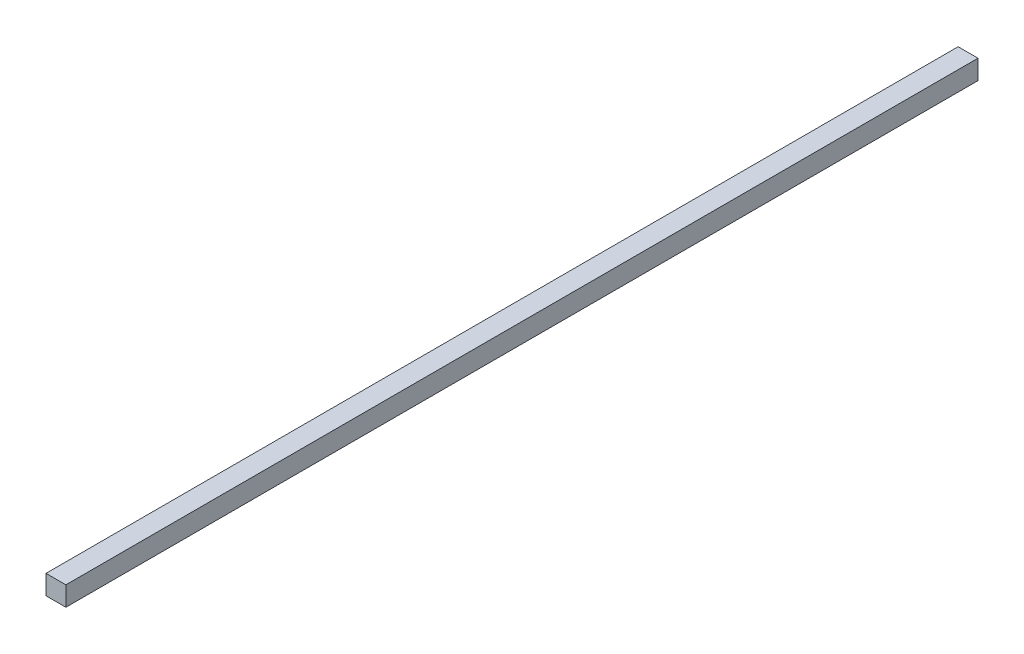
ISO-10303-21;
HEADER;
FILE_DESCRIPTION(('STEP AP214'),'2;1');
FILE_NAME('part.step','',(''),(''),'','','');
FILE_SCHEMA(('AUTOMOTIVE_DESIGN { 1 0 10303 214 1 1 1 1 }'));
ENDSEC;
DATA;
#1=APPLICATION_CONTEXT('core data for automotive mechanical design processes');
#2=APPLICATION_PROTOCOL_DEFINITION('international standard','automotive_design',2000,#1);
#3=PRODUCT_CONTEXT('',#1,'mechanical');
#4=PRODUCT('Part','Part','',(#3));
#5=PRODUCT_RELATED_PRODUCT_CATEGORY('part','',(#4));
#6=PRODUCT_DEFINITION_FORMATION('','',#4);
#7=PRODUCT_DEFINITION_CONTEXT('part definition',#1,'design');
#8=PRODUCT_DEFINITION('design','',#6,#7);
#9=PRODUCT_DEFINITION_SHAPE('','',#8);
#10=(LENGTH_UNIT() NAMED_UNIT(*) SI_UNIT(.MILLI.,.METRE.));
#11=(NAMED_UNIT(*) PLANE_ANGLE_UNIT() SI_UNIT($,.RADIAN.));
#12=(NAMED_UNIT(*) SI_UNIT($,.STERADIAN.) SOLID_ANGLE_UNIT());
#13=UNCERTAINTY_MEASURE_WITH_UNIT(LENGTH_MEASURE(1.E-05),#10,'distance_accuracy_value','');
#14=(GEOMETRIC_REPRESENTATION_CONTEXT(3) GLOBAL_UNCERTAINTY_ASSIGNED_CONTEXT((#13)) GLOBAL_UNIT_ASSIGNED_CONTEXT((#10,
#11,#12)) REPRESENTATION_CONTEXT('',''));
#15=CARTESIAN_POINT('',(0.,0.,0.));
#16=DIRECTION('',(0.,0.,1.));
#17=DIRECTION('',(1.,0.,0.));
#18=AXIS2_PLACEMENT_3D('',#15,#16,#17);
#19=CARTESIAN_POINT('',(3.31364071407139,28.8520909090909,2540.));
#20=DIRECTION('',(-1.,0.,0.));
#21=DIRECTION('',(0.,0.,1.));
#22=AXIS2_PLACEMENT_3D('',#19,#20,#21);
#23=PLANE('',#22);
#24=DIRECTION('',(0.,1.,0.));
#25=VECTOR('',#24,1.);
#26=CARTESIAN_POINT('',(3.31364071407139,28.8520909090909,0.));
#27=LINE('',#26,#25);
#28=CARTESIAN_POINT('',(3.31364071407139,-25.3191818181818,0.));
#29=VERTEX_POINT('',#28);
#30=CARTESIAN_POINT('',(3.31364071407139,28.8520909090909,0.));
#31=VERTEX_POINT('',#30);
#32=EDGE_CURVE('E98',#29,#31,#27,.T.);
#33=ORIENTED_EDGE('',*,*,#32,.T.);
#34=DIRECTION('',(0.,0.,-1.));
#35=VECTOR('',#34,1.);
#36=CARTESIAN_POINT('',(3.31364071407139,28.8520909090909,2540.));
#37=LINE('',#36,#35);
#38=CARTESIAN_POINT('',(3.31364071407139,28.8520909090909,2540.));
#39=VERTEX_POINT('',#38);
#40=EDGE_CURVE('E11',#39,#31,#37,.T.);
#41=ORIENTED_EDGE('',*,*,#40,.F.);
#42=DIRECTION('',(0.,1.,0.));
#43=VECTOR('',#42,1.);
#44=CARTESIAN_POINT('',(3.31364071407139,28.8520909090909,2540.));
#45=LINE('',#44,#43);
#46=CARTESIAN_POINT('',(3.31364071407139,-25.3191818181818,2540.));
#47=VERTEX_POINT('',#46);
#48=EDGE_CURVE('E86',#47,#39,#45,.T.);
#49=ORIENTED_EDGE('',*,*,#48,.F.);
#50=DIRECTION('',(0.,0.,-1.));
#51=VECTOR('',#50,1.);
#52=CARTESIAN_POINT('',(3.31364071407139,-25.3191818181818,2540.));
#53=LINE('',#52,#51);
#54=EDGE_CURVE('E94',#47,#29,#53,.T.);
#55=ORIENTED_EDGE('',*,*,#54,.T.);
#56=EDGE_LOOP('',(#33,#41,#49,#55));
#57=FACE_BOUND('',#56,.T.);
#58=ADVANCED_FACE('F35',(#57),#23,.F.);
#59=CARTESIAN_POINT('',(-52.0352683768377,28.8520909090909,2540.));
#60=DIRECTION('',(0.,-1.,0.));
#61=DIRECTION('',(0.,0.,-1.));
#62=AXIS2_PLACEMENT_3D('',#59,#60,#61);
#63=PLANE('',#62);
#64=DIRECTION('',(-1.,0.,0.));
#65=VECTOR('',#64,1.);
#66=CARTESIAN_POINT('',(-52.0352683768377,28.8520909090909,0.));
#67=LINE('',#66,#65);
#68=CARTESIAN_POINT('',(-52.0352683768377,28.8520909090909,0.));
#69=VERTEX_POINT('',#68);
#70=EDGE_CURVE('E90',#31,#69,#67,.T.);
#71=ORIENTED_EDGE('',*,*,#70,.T.);
#72=DIRECTION('',(0.,0.,-1.));
#73=VECTOR('',#72,1.);
#74=CARTESIAN_POINT('',(-52.0352683768377,28.8520909090909,2540.));
#75=LINE('',#74,#73);
#76=CARTESIAN_POINT('',(-52.0352683768377,28.8520909090909,2540.));
#77=VERTEX_POINT('',#76);
#78=EDGE_CURVE('E43',#77,#69,#75,.T.);
#79=ORIENTED_EDGE('',*,*,#78,.F.);
#80=DIRECTION('',(-1.,0.,0.));
#81=VECTOR('',#80,1.);
#82=CARTESIAN_POINT('',(-52.0352683768377,28.8520909090909,2540.));
#83=LINE('',#82,#81);
#84=EDGE_CURVE('E81',#39,#77,#83,.T.);
#85=ORIENTED_EDGE('',*,*,#84,.F.);
#86=ORIENTED_EDGE('',*,*,#40,.T.);
#87=EDGE_LOOP('',(#71,#79,#85,#86));
#88=FACE_BOUND('',#87,.T.);
#89=ADVANCED_FACE('F89',(#88),#63,.F.);
#90=CARTESIAN_POINT('',(-52.0352683768377,28.8520909090909,2540.));
#91=DIRECTION('',(1.,0.,0.));
#92=DIRECTION('',(0.,0.,-1.));
#93=AXIS2_PLACEMENT_3D('',#90,#91,#92);
#94=PLANE('',#93);
#95=DIRECTION('',(0.,-1.,0.));
#96=VECTOR('',#95,1.);
#97=CARTESIAN_POINT('',(-52.0352683768377,28.8520909090909,0.));
#98=LINE('',#97,#96);
#99=CARTESIAN_POINT('',(-52.0352683768377,-25.3191818181818,0.));
#100=VERTEX_POINT('',#99);
#101=EDGE_CURVE('E68',#69,#100,#98,.T.);
#102=ORIENTED_EDGE('',*,*,#101,.T.);
#103=DIRECTION('',(0.,0.,-1.));
#104=VECTOR('',#103,1.);
#105=CARTESIAN_POINT('',(-52.0352683768377,-25.3191818181818,2540.));
#106=LINE('',#105,#104);
#107=CARTESIAN_POINT('',(-52.0352683768377,-25.3191818181818,2540.));
#108=VERTEX_POINT('',#107);
#109=EDGE_CURVE('E91',#108,#100,#106,.T.);
#110=ORIENTED_EDGE('',*,*,#109,.F.);
#111=DIRECTION('',(0.,-1.,0.));
#112=VECTOR('',#111,1.);
#113=CARTESIAN_POINT('',(-52.0352683768377,28.8520909090909,2540.));
#114=LINE('',#113,#112);
#115=EDGE_CURVE('E84',#77,#108,#114,.T.);
#116=ORIENTED_EDGE('',*,*,#115,.F.);
#117=ORIENTED_EDGE('',*,*,#78,.T.);
#118=EDGE_LOOP('',(#102,#110,#116,#117));
#119=FACE_BOUND('',#118,.T.);
#120=ADVANCED_FACE('F92',(#119),#94,.F.);
#121=CARTESIAN_POINT('',(-52.0352683768377,-25.3191818181818,2540.));
#122=DIRECTION('',(0.,1.,0.));
#123=DIRECTION('',(0.,0.,1.));
#124=AXIS2_PLACEMENT_3D('',#121,#122,#123);
#125=PLANE('',#124);
#126=DIRECTION('',(1.,0.,0.));
#127=VECTOR('',#126,1.);
#128=CARTESIAN_POINT('',(-52.0352683768377,-25.3191818181818,0.));
#129=LINE('',#128,#127);
#130=EDGE_CURVE('E74',#100,#29,#129,.T.);
#131=ORIENTED_EDGE('',*,*,#130,.T.);
#132=ORIENTED_EDGE('',*,*,#54,.F.);
#133=DIRECTION('',(1.,0.,0.));
#134=VECTOR('',#133,1.);
#135=CARTESIAN_POINT('',(-52.0352683768377,-25.3191818181818,2540.));
#136=LINE('',#135,#134);
#137=EDGE_CURVE('E51',#108,#47,#136,.T.);
#138=ORIENTED_EDGE('',*,*,#137,.F.);
#139=ORIENTED_EDGE('',*,*,#109,.T.);
#140=EDGE_LOOP('',(#131,#132,#138,#139));
#141=FACE_BOUND('',#140,.T.);
#142=ADVANCED_FACE('F105',(#141),#125,.F.);
#143=CARTESIAN_POINT('',(0.,0.,2540.));
#144=DIRECTION('',(0.,0.,1.));
#145=DIRECTION('',(1.,0.,0.));
#146=AXIS2_PLACEMENT_3D('',#143,#144,#145);
#147=PLANE('',#146);
#148=ORIENTED_EDGE('',*,*,#48,.T.);
#149=ORIENTED_EDGE('',*,*,#84,.T.);
#150=ORIENTED_EDGE('',*,*,#115,.T.);
#151=ORIENTED_EDGE('',*,*,#137,.T.);
#152=EDGE_LOOP('',(#148,#149,#150,#151));
#153=FACE_BOUND('',#152,.T.);
#154=ADVANCED_FACE('F82',(#153),#147,.T.);
#155=CARTESIAN_POINT('',(0.,0.,0.));
#156=DIRECTION('',(0.,0.,1.));
#157=DIRECTION('',(1.,0.,0.));
#158=AXIS2_PLACEMENT_3D('',#155,#156,#157);
#159=PLANE('',#158);
#160=ORIENTED_EDGE('',*,*,#32,.F.);
#161=ORIENTED_EDGE('',*,*,#130,.F.);
#162=ORIENTED_EDGE('',*,*,#101,.F.);
#163=ORIENTED_EDGE('',*,*,#70,.F.);
#164=EDGE_LOOP('',(#160,#161,#162,#163));
#165=FACE_BOUND('',#164,.T.);
#166=ADVANCED_FACE('F108',(#165),#159,.F.);
#167=CLOSED_SHELL('',(#58,#89,#120,#142,#154,#166));
#168=MANIFOLD_SOLID_BREP('B2',#167);
#169=ADVANCED_BREP_SHAPE_REPRESENTATION('',(#18,#168),#14);
#170=SHAPE_DEFINITION_REPRESENTATION(#9,#169);
ENDSEC;
END-ISO-10303-21;
